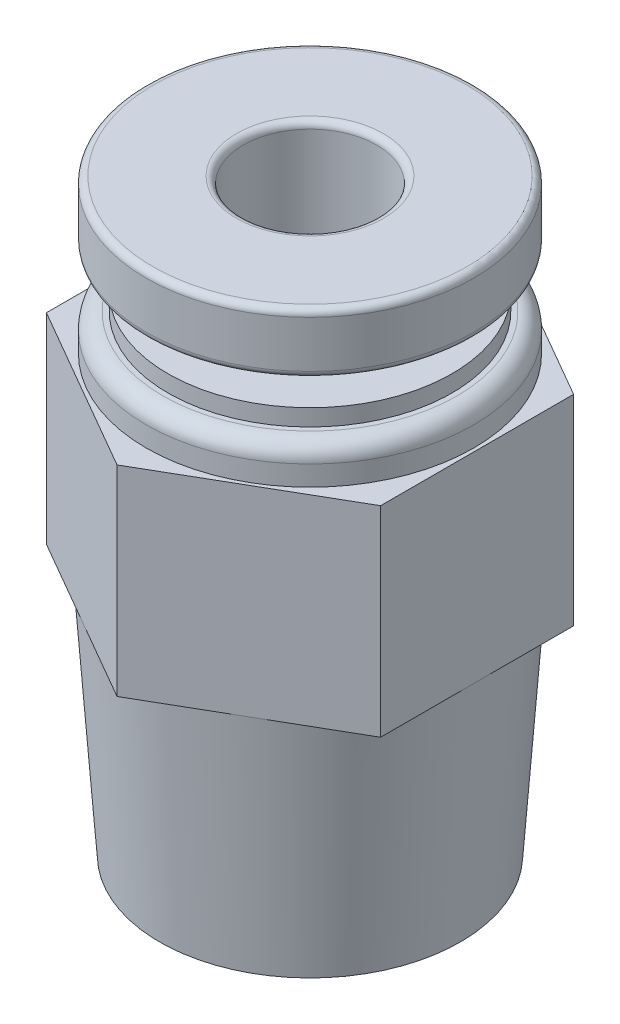
ISO-10303-21;
HEADER;
FILE_DESCRIPTION(('STEP AP214'),'2;1');
FILE_NAME('part.step','',(''),(''),'','','');
FILE_SCHEMA(('AUTOMOTIVE_DESIGN { 1 0 10303 214 1 1 1 1 }'));
ENDSEC;
DATA;
#1=APPLICATION_CONTEXT('core data for automotive mechanical design processes');
#2=APPLICATION_PROTOCOL_DEFINITION('international standard','automotive_design',2000,#1);
#3=PRODUCT_CONTEXT('',#1,'mechanical');
#4=PRODUCT('Part','Part','',(#3));
#5=PRODUCT_RELATED_PRODUCT_CATEGORY('part','',(#4));
#6=PRODUCT_DEFINITION_FORMATION('','',#4);
#7=PRODUCT_DEFINITION_CONTEXT('part definition',#1,'design');
#8=PRODUCT_DEFINITION('design','',#6,#7);
#9=PRODUCT_DEFINITION_SHAPE('','',#8);
#10=(LENGTH_UNIT() NAMED_UNIT(*) SI_UNIT(.MILLI.,.METRE.));
#11=(NAMED_UNIT(*) PLANE_ANGLE_UNIT() SI_UNIT($,.RADIAN.));
#12=(NAMED_UNIT(*) SI_UNIT($,.STERADIAN.) SOLID_ANGLE_UNIT());
#13=UNCERTAINTY_MEASURE_WITH_UNIT(LENGTH_MEASURE(1.E-05),#10,'distance_accuracy_value','');
#14=(GEOMETRIC_REPRESENTATION_CONTEXT(3) GLOBAL_UNCERTAINTY_ASSIGNED_CONTEXT((#13)) GLOBAL_UNIT_ASSIGNED_CONTEXT((#10,
#11,#12)) REPRESENTATION_CONTEXT('',''));
#15=CARTESIAN_POINT('',(0.,0.,0.));
#16=DIRECTION('',(0.,0.,1.));
#17=DIRECTION('',(1.,0.,0.));
#18=AXIS2_PLACEMENT_3D('',#15,#16,#17);
#19=CARTESIAN_POINT('',(0.,17.6,0.));
#20=DIRECTION('',(0.,-1.,0.));
#21=DIRECTION('',(0.,0.,-1.));
#22=AXIS2_PLACEMENT_3D('',#19,#20,#21);
#23=PLANE('',#22);
#24=CARTESIAN_POINT('',(0.,17.6,0.));
#25=DIRECTION('',(0.,-1.,0.));
#26=DIRECTION('',(0.,0.,-1.));
#27=AXIS2_PLACEMENT_3D('',#24,#25,#26);
#28=CIRCLE('',#27,2.2);
#29=CARTESIAN_POINT('',(0.,17.6,-2.2));
#30=VERTEX_POINT('',#29);
#31=EDGE_CURVE('E115',#30,#30,#28,.T.);
#32=ORIENTED_EDGE('',*,*,#31,.T.);
#33=EDGE_LOOP('',(#32));
#34=FACE_BOUND('',#33,.T.);
#35=CARTESIAN_POINT('',(0.,17.6,0.));
#36=DIRECTION('',(0.,-1.,0.));
#37=DIRECTION('',(0.,0.,-1.));
#38=AXIS2_PLACEMENT_3D('',#35,#36,#37);
#39=CIRCLE('',#38,4.7);
#40=CARTESIAN_POINT('',(0.,17.6,-4.7));
#41=VERTEX_POINT('',#40);
#42=EDGE_CURVE('E112',#41,#41,#39,.F.);
#43=ORIENTED_EDGE('',*,*,#42,.T.);
#44=EDGE_LOOP('',(#43));
#45=FACE_BOUND('',#44,.T.);
#46=ADVANCED_FACE('F17',(#34,#45),#23,.F.);
#47=CARTESIAN_POINT('',(0.,0.,0.));
#48=DIRECTION('',(0.,-1.,0.));
#49=DIRECTION('',(0.,0.,-1.));
#50=AXIS2_PLACEMENT_3D('',#47,#48,#49);
#51=PLANE('',#50);
#52=CARTESIAN_POINT('',(0.,0.,0.));
#53=DIRECTION('',(0.,1.,0.));
#54=DIRECTION('',(0.,0.,1.));
#55=AXIS2_PLACEMENT_3D('',#52,#53,#54);
#56=CIRCLE('',#55,2.);
#57=CARTESIAN_POINT('',(0.,0.,2.));
#58=VERTEX_POINT('',#57);
#59=EDGE_CURVE('E88',#58,#58,#56,.T.);
#60=ORIENTED_EDGE('',*,*,#59,.T.);
#61=EDGE_LOOP('',(#60));
#62=FACE_BOUND('',#61,.T.);
#63=CARTESIAN_POINT('',(0.,0.,0.));
#64=DIRECTION('',(0.,-1.,0.));
#65=DIRECTION('',(0.,0.,-1.));
#66=AXIS2_PLACEMENT_3D('',#63,#64,#65);
#67=CIRCLE('',#66,4.5);
#68=CARTESIAN_POINT('',(0.,0.,-4.5));
#69=VERTEX_POINT('',#68);
#70=EDGE_CURVE('E81',#69,#69,#67,.T.);
#71=ORIENTED_EDGE('',*,*,#70,.T.);
#72=EDGE_LOOP('',(#71));
#73=FACE_BOUND('',#72,.T.);
#74=ADVANCED_FACE('F137',(#62,#73),#51,.T.);
#75=CARTESIAN_POINT('',(-5.,17.6,-2.88675134594813));
#76=DIRECTION('',(0.5,0.,0.866025403784438));
#77=DIRECTION('',(0.866025403784438,0.,-0.5));
#78=AXIS2_PLACEMENT_3D('',#75,#76,#77);
#79=PLANE('',#78);
#80=DIRECTION('',(0.,-1.,0.));
#81=VECTOR('',#80,1.);
#82=CARTESIAN_POINT('',(-5.,17.6,-2.88675134594813));
#83=LINE('',#82,#81);
#84=CARTESIAN_POINT('',(-5.,13.,-2.88675134594813));
#85=VERTEX_POINT('',#84);
#86=CARTESIAN_POINT('',(-5.,7.,-2.88675134594813));
#87=VERTEX_POINT('',#86);
#88=EDGE_CURVE('E80',#85,#87,#83,.T.);
#89=ORIENTED_EDGE('',*,*,#88,.F.);
#90=DIRECTION('',(0.866025403784438,0.,-0.5));
#91=VECTOR('',#90,1.);
#92=CARTESIAN_POINT('',(-5.,13.,-2.88675134594813));
#93=LINE('',#92,#91);
#94=CARTESIAN_POINT('',(0.,13.,-5.77350269189627));
#95=VERTEX_POINT('',#94);
#96=EDGE_CURVE('E71',#85,#95,#93,.T.);
#97=ORIENTED_EDGE('',*,*,#96,.T.);
#98=DIRECTION('',(0.,-1.,0.));
#99=VECTOR('',#98,1.);
#100=CARTESIAN_POINT('',(0.,17.6,-5.77350269189627));
#101=LINE('',#100,#99);
#102=CARTESIAN_POINT('',(0.,7.,-5.77350269189627));
#103=VERTEX_POINT('',#102);
#104=EDGE_CURVE('E40',#95,#103,#101,.T.);
#105=ORIENTED_EDGE('',*,*,#104,.T.);
#106=DIRECTION('',(0.866025403784438,0.,-0.5));
#107=VECTOR('',#106,1.);
#108=CARTESIAN_POINT('',(-5.,7.,-2.88675134594813));
#109=LINE('',#108,#107);
#110=EDGE_CURVE('E93',#87,#103,#109,.T.);
#111=ORIENTED_EDGE('',*,*,#110,.F.);
#112=EDGE_LOOP('',(#89,#97,#105,#111));
#113=FACE_BOUND('',#112,.T.);
#114=ADVANCED_FACE('F79',(#113),#79,.F.);
#115=CARTESIAN_POINT('',(-5.,17.6,2.88675134594811));
#116=DIRECTION('',(1.,0.,0.));
#117=DIRECTION('',(0.,0.,-1.));
#118=AXIS2_PLACEMENT_3D('',#115,#116,#117);
#119=PLANE('',#118);
#120=DIRECTION('',(0.,-1.,0.));
#121=VECTOR('',#120,1.);
#122=CARTESIAN_POINT('',(-5.,17.6,2.88675134594811));
#123=LINE('',#122,#121);
#124=CARTESIAN_POINT('',(-5.,13.,2.88675134594811));
#125=VERTEX_POINT('',#124);
#126=CARTESIAN_POINT('',(-5.,7.,2.88675134594811));
#127=VERTEX_POINT('',#126);
#128=EDGE_CURVE('E100',#125,#127,#123,.T.);
#129=ORIENTED_EDGE('',*,*,#128,.F.);
#130=DIRECTION('',(0.,0.,-1.));
#131=VECTOR('',#130,1.);
#132=CARTESIAN_POINT('',(-5.,13.,2.88675134594811));
#133=LINE('',#132,#131);
#134=EDGE_CURVE('E82',#125,#85,#133,.T.);
#135=ORIENTED_EDGE('',*,*,#134,.T.);
#136=ORIENTED_EDGE('',*,*,#88,.T.);
#137=DIRECTION('',(0.,0.,-1.));
#138=VECTOR('',#137,1.);
#139=CARTESIAN_POINT('',(-5.,7.,2.88675134594811));
#140=LINE('',#139,#138);
#141=EDGE_CURVE('E236',#127,#87,#140,.T.);
#142=ORIENTED_EDGE('',*,*,#141,.F.);
#143=EDGE_LOOP('',(#129,#135,#136,#142));
#144=FACE_BOUND('',#143,.T.);
#145=ADVANCED_FACE('F165',(#144),#119,.F.);
#146=CARTESIAN_POINT('',(0.,17.6,5.77350269189627));
#147=DIRECTION('',(0.5,0.,-0.866025403784436));
#148=DIRECTION('',(-0.866025403784437,0.,-0.5));
#149=AXIS2_PLACEMENT_3D('',#146,#147,#148);
#150=PLANE('',#149);
#151=DIRECTION('',(0.,-1.,0.));
#152=VECTOR('',#151,1.);
#153=CARTESIAN_POINT('',(0.,17.6,5.77350269189627));
#154=LINE('',#153,#152);
#155=CARTESIAN_POINT('',(0.,13.,5.77350269189626));
#156=VERTEX_POINT('',#155);
#157=CARTESIAN_POINT('',(0.,7.,5.77350269189627));
#158=VERTEX_POINT('',#157);
#159=EDGE_CURVE('E98',#156,#158,#154,.T.);
#160=ORIENTED_EDGE('',*,*,#159,.F.);
#161=DIRECTION('',(-0.866025403784437,0.,-0.5));
#162=VECTOR('',#161,1.);
#163=CARTESIAN_POINT('',(0.,13.,5.77350269189627));
#164=LINE('',#163,#162);
#165=EDGE_CURVE('E244',#156,#125,#164,.T.);
#166=ORIENTED_EDGE('',*,*,#165,.T.);
#167=ORIENTED_EDGE('',*,*,#128,.T.);
#168=DIRECTION('',(-0.866025403784437,0.,-0.5));
#169=VECTOR('',#168,1.);
#170=CARTESIAN_POINT('',(0.,7.,5.77350269189627));
#171=LINE('',#170,#169);
#172=EDGE_CURVE('E233',#158,#127,#171,.T.);
#173=ORIENTED_EDGE('',*,*,#172,.F.);
#174=EDGE_LOOP('',(#160,#166,#167,#173));
#175=FACE_BOUND('',#174,.T.);
#176=ADVANCED_FACE('F161',(#175),#150,.F.);
#177=CARTESIAN_POINT('',(5.,17.6,2.88675134594813));
#178=DIRECTION('',(-0.5,0.,-0.866025403784438));
#179=DIRECTION('',(-0.866025403784438,0.,0.5));
#180=AXIS2_PLACEMENT_3D('',#177,#178,#179);
#181=PLANE('',#180);
#182=DIRECTION('',(0.,-1.,0.));
#183=VECTOR('',#182,1.);
#184=CARTESIAN_POINT('',(5.,17.6,2.88675134594813));
#185=LINE('',#184,#183);
#186=CARTESIAN_POINT('',(5.,13.,2.88675134594813));
#187=VERTEX_POINT('',#186);
#188=CARTESIAN_POINT('',(5.,7.,2.88675134594813));
#189=VERTEX_POINT('',#188);
#190=EDGE_CURVE('E90',#187,#189,#185,.T.);
#191=ORIENTED_EDGE('',*,*,#190,.F.);
#192=DIRECTION('',(-0.866025403784438,0.,0.5));
#193=VECTOR('',#192,1.);
#194=CARTESIAN_POINT('',(5.,13.,2.88675134594813));
#195=LINE('',#194,#193);
#196=EDGE_CURVE('E245',#187,#156,#195,.T.);
#197=ORIENTED_EDGE('',*,*,#196,.T.);
#198=ORIENTED_EDGE('',*,*,#159,.T.);
#199=DIRECTION('',(-0.866025403784438,0.,0.5));
#200=VECTOR('',#199,1.);
#201=CARTESIAN_POINT('',(5.,7.,2.88675134594813));
#202=LINE('',#201,#200);
#203=EDGE_CURVE('E230',#189,#158,#202,.T.);
#204=ORIENTED_EDGE('',*,*,#203,.F.);
#205=EDGE_LOOP('',(#191,#197,#198,#204));
#206=FACE_BOUND('',#205,.T.);
#207=ADVANCED_FACE('F157',(#206),#181,.F.);
#208=CARTESIAN_POINT('',(5.,17.6,-2.88675134594812));
#209=DIRECTION('',(-1.,0.,0.));
#210=DIRECTION('',(0.,0.,1.));
#211=AXIS2_PLACEMENT_3D('',#208,#209,#210);
#212=PLANE('',#211);
#213=DIRECTION('',(0.,-1.,0.));
#214=VECTOR('',#213,1.);
#215=CARTESIAN_POINT('',(5.,17.6,-2.88675134594812));
#216=LINE('',#215,#214);
#217=CARTESIAN_POINT('',(5.,13.,-2.88675134594812));
#218=VERTEX_POINT('',#217);
#219=CARTESIAN_POINT('',(5.,7.,-2.88675134594812));
#220=VERTEX_POINT('',#219);
#221=EDGE_CURVE('E87',#218,#220,#216,.T.);
#222=ORIENTED_EDGE('',*,*,#221,.F.);
#223=DIRECTION('',(0.,0.,1.));
#224=VECTOR('',#223,1.);
#225=CARTESIAN_POINT('',(5.,13.,-2.88675134594812));
#226=LINE('',#225,#224);
#227=EDGE_CURVE('E32',#218,#187,#226,.T.);
#228=ORIENTED_EDGE('',*,*,#227,.T.);
#229=ORIENTED_EDGE('',*,*,#190,.T.);
#230=DIRECTION('',(0.,0.,1.));
#231=VECTOR('',#230,1.);
#232=CARTESIAN_POINT('',(5.,7.,-2.88675134594812));
#233=LINE('',#232,#231);
#234=EDGE_CURVE('E224',#220,#189,#233,.T.);
#235=ORIENTED_EDGE('',*,*,#234,.F.);
#236=EDGE_LOOP('',(#222,#228,#229,#235));
#237=FACE_BOUND('',#236,.T.);
#238=ADVANCED_FACE('F154',(#237),#212,.F.);
#239=CARTESIAN_POINT('',(0.,17.6,-5.77350269189627));
#240=DIRECTION('',(-0.5,0.,0.866025403784437));
#241=DIRECTION('',(0.866025403784437,0.,0.5));
#242=AXIS2_PLACEMENT_3D('',#239,#240,#241);
#243=PLANE('',#242);
#244=ORIENTED_EDGE('',*,*,#104,.F.);
#245=DIRECTION('',(0.866025403784437,0.,0.5));
#246=VECTOR('',#245,1.);
#247=CARTESIAN_POINT('',(0.,13.,-5.77350269189627));
#248=LINE('',#247,#246);
#249=EDGE_CURVE('E69',#95,#218,#248,.T.);
#250=ORIENTED_EDGE('',*,*,#249,.T.);
#251=ORIENTED_EDGE('',*,*,#221,.T.);
#252=DIRECTION('',(0.866025403784437,0.,0.5));
#253=VECTOR('',#252,1.);
#254=CARTESIAN_POINT('',(0.,7.,-5.77350269189627));
#255=LINE('',#254,#253);
#256=EDGE_CURVE('E76',#103,#220,#255,.T.);
#257=ORIENTED_EDGE('',*,*,#256,.F.);
#258=EDGE_LOOP('',(#244,#250,#251,#257));
#259=FACE_BOUND('',#258,.T.);
#260=ADVANCED_FACE('F85',(#259),#243,.F.);
#261=CARTESIAN_POINT('',(0.,17.6,0.));
#262=DIRECTION('',(0.,-1.,0.));
#263=DIRECTION('',(0.,0.,-1.));
#264=AXIS2_PLACEMENT_3D('',#261,#262,#263);
#265=CYLINDRICAL_SURFACE('',#264,2.);
#266=CARTESIAN_POINT('',(0.,17.4,0.));
#267=DIRECTION('',(0.,-1.,0.));
#268=DIRECTION('',(0.,0.,-1.));
#269=AXIS2_PLACEMENT_3D('',#266,#267,#268);
#270=CIRCLE('',#269,2.);
#271=CARTESIAN_POINT('',(0.,17.4,-2.));
#272=VERTEX_POINT('',#271);
#273=EDGE_CURVE('E109',#272,#272,#270,.F.);
#274=ORIENTED_EDGE('',*,*,#273,.T.);
#275=EDGE_LOOP('',(#274));
#276=FACE_BOUND('',#275,.T.);
#277=ORIENTED_EDGE('',*,*,#59,.F.);
#278=EDGE_LOOP('',(#277));
#279=FACE_BOUND('',#278,.T.);
#280=ADVANCED_FACE('F149',(#276,#279),#265,.F.);
#281=CARTESIAN_POINT('',(0.,7.,0.));
#282=DIRECTION('',(0.,-1.,0.));
#283=DIRECTION('',(0.,0.,-1.));
#284=AXIS2_PLACEMENT_3D('',#281,#282,#283);
#285=PLANE('',#284);
#286=CARTESIAN_POINT('',(0.,7.,0.));
#287=DIRECTION('',(0.,-1.,0.));
#288=DIRECTION('',(0.,0.,-1.));
#289=AXIS2_PLACEMENT_3D('',#286,#287,#288);
#290=CIRCLE('',#289,4.98948768360457);
#291=CARTESIAN_POINT('',(0.,7.,-4.98948768360457));
#292=VERTEX_POINT('',#291);
#293=EDGE_CURVE('E219',#292,#292,#290,.T.);
#294=ORIENTED_EDGE('',*,*,#293,.F.);
#295=EDGE_LOOP('',(#294));
#296=FACE_BOUND('',#295,.T.);
#297=ORIENTED_EDGE('',*,*,#110,.T.);
#298=ORIENTED_EDGE('',*,*,#256,.T.);
#299=ORIENTED_EDGE('',*,*,#234,.T.);
#300=ORIENTED_EDGE('',*,*,#203,.T.);
#301=ORIENTED_EDGE('',*,*,#172,.T.);
#302=ORIENTED_EDGE('',*,*,#141,.T.);
#303=EDGE_LOOP('',(#297,#298,#299,#300,#301,#302));
#304=FACE_BOUND('',#303,.T.);
#305=ADVANCED_FACE('F207',(#296,#304),#285,.T.);
#306=CARTESIAN_POINT('',(0.,0.,0.));
#307=DIRECTION('',(0.,1.,0.));
#308=DIRECTION('',(0.,0.,-1.));
#309=AXIS2_PLACEMENT_3D('',#306,#307,#308);
#310=CONICAL_SURFACE('',#309,4.5,0.0698131700797734);
#311=ORIENTED_EDGE('',*,*,#293,.T.);
#312=EDGE_LOOP('',(#311));
#313=FACE_BOUND('',#312,.T.);
#314=ORIENTED_EDGE('',*,*,#70,.F.);
#315=EDGE_LOOP('',(#314));
#316=FACE_BOUND('',#315,.T.);
#317=ADVANCED_FACE('F202',(#313,#316),#310,.T.);
#318=CARTESIAN_POINT('',(-4.9,13.,0.));
#319=DIRECTION('',(0.,-1.,0.));
#320=DIRECTION('',(1.,0.,0.));
#321=AXIS2_PLACEMENT_3D('',#318,#319,#320);
#322=PLANE('',#321);
#323=CARTESIAN_POINT('',(0.,13.,0.));
#324=DIRECTION('',(0.,1.,0.));
#325=DIRECTION('',(-1.,0.,0.));
#326=AXIS2_PLACEMENT_3D('',#323,#324,#325);
#327=CIRCLE('',#326,4.9);
#328=CARTESIAN_POINT('',(-4.9,13.,0.));
#329=VERTEX_POINT('',#328);
#330=EDGE_CURVE('E260',#329,#329,#327,.T.);
#331=ORIENTED_EDGE('',*,*,#330,.F.);
#332=EDGE_LOOP('',(#331));
#333=FACE_BOUND('',#332,.T.);
#334=ORIENTED_EDGE('',*,*,#134,.F.);
#335=ORIENTED_EDGE('',*,*,#165,.F.);
#336=ORIENTED_EDGE('',*,*,#196,.F.);
#337=ORIENTED_EDGE('',*,*,#227,.F.);
#338=ORIENTED_EDGE('',*,*,#249,.F.);
#339=ORIENTED_EDGE('',*,*,#96,.F.);
#340=EDGE_LOOP('',(#334,#335,#336,#337,#338,#339));
#341=FACE_BOUND('',#340,.T.);
#342=ADVANCED_FACE('F70',(#333,#341),#322,.F.);
#343=CARTESIAN_POINT('',(0.,22.2170384822299,0.));
#344=DIRECTION('',(0.,1.,0.));
#345=DIRECTION('',(-1.,0.,0.));
#346=AXIS2_PLACEMENT_3D('',#343,#344,#345);
#347=CYLINDRICAL_SURFACE('',#346,4.9);
#348=CARTESIAN_POINT('',(0.,16.,0.));
#349=DIRECTION('',(0.,1.,0.));
#350=DIRECTION('',(-1.,0.,0.));
#351=AXIS2_PLACEMENT_3D('',#348,#349,#350);
#352=CIRCLE('',#351,4.9);
#353=CARTESIAN_POINT('',(-4.9,16.,0.));
#354=VERTEX_POINT('',#353);
#355=EDGE_CURVE('E11',#354,#354,#352,.T.);
#356=ORIENTED_EDGE('',*,*,#355,.T.);
#357=EDGE_LOOP('',(#356));
#358=FACE_BOUND('',#357,.T.);
#359=CARTESIAN_POINT('',(0.,17.4,0.));
#360=DIRECTION('',(0.,-1.,0.));
#361=DIRECTION('',(0.,0.,-1.));
#362=AXIS2_PLACEMENT_3D('',#359,#360,#361);
#363=CIRCLE('',#362,4.9);
#364=CARTESIAN_POINT('',(0.,17.4,-4.9));
#365=VERTEX_POINT('',#364);
#366=EDGE_CURVE('E25',#365,#365,#363,.T.);
#367=ORIENTED_EDGE('',*,*,#366,.T.);
#368=EDGE_LOOP('',(#367));
#369=FACE_BOUND('',#368,.T.);
#370=ADVANCED_FACE('F129',(#358,#369),#347,.T.);
#371=CARTESIAN_POINT('',(-4.9,15.8,0.));
#372=DIRECTION('',(0.,1.,0.));
#373=DIRECTION('',(-1.,0.,0.));
#374=AXIS2_PLACEMENT_3D('',#371,#372,#373);
#375=PLANE('',#374);
#376=CARTESIAN_POINT('',(0.,15.8,0.));
#377=DIRECTION('',(0.,1.,0.));
#378=DIRECTION('',(-1.,0.,0.));
#379=AXIS2_PLACEMENT_3D('',#376,#377,#378);
#380=CIRCLE('',#379,2.95);
#381=CARTESIAN_POINT('',(-2.95,15.8,0.));
#382=VERTEX_POINT('',#381);
#383=EDGE_CURVE('E121',#382,#382,#380,.T.);
#384=ORIENTED_EDGE('',*,*,#383,.T.);
#385=EDGE_LOOP('',(#384));
#386=FACE_BOUND('',#385,.T.);
#387=CARTESIAN_POINT('',(0.,15.8,0.));
#388=DIRECTION('',(0.,1.,0.));
#389=DIRECTION('',(-1.,0.,0.));
#390=AXIS2_PLACEMENT_3D('',#387,#388,#389);
#391=CIRCLE('',#390,4.7);
#392=CARTESIAN_POINT('',(-4.7,15.8,0.));
#393=VERTEX_POINT('',#392);
#394=EDGE_CURVE('E118',#393,#393,#391,.F.);
#395=ORIENTED_EDGE('',*,*,#394,.T.);
#396=EDGE_LOOP('',(#395));
#397=FACE_BOUND('',#396,.T.);
#398=ADVANCED_FACE('F193',(#386,#397),#375,.F.);
#399=CARTESIAN_POINT('',(0.,22.2170384822299,0.));
#400=DIRECTION('',(0.,1.,0.));
#401=DIRECTION('',(-1.,0.,0.));
#402=AXIS2_PLACEMENT_3D('',#399,#400,#401);
#403=CYLINDRICAL_SURFACE('',#402,2.75);
#404=CARTESIAN_POINT('',(0.,15.6,0.));
#405=DIRECTION('',(0.,1.,0.));
#406=DIRECTION('',(-1.,0.,0.));
#407=AXIS2_PLACEMENT_3D('',#404,#405,#406);
#408=CIRCLE('',#407,2.75);
#409=CARTESIAN_POINT('',(-2.75,15.6,0.));
#410=VERTEX_POINT('',#409);
#411=EDGE_CURVE('E124',#410,#410,#408,.F.);
#412=ORIENTED_EDGE('',*,*,#411,.T.);
#413=EDGE_LOOP('',(#412));
#414=FACE_BOUND('',#413,.T.);
#415=CARTESIAN_POINT('',(0.,14.6,0.));
#416=DIRECTION('',(0.,1.,0.));
#417=DIRECTION('',(-1.,0.,0.));
#418=AXIS2_PLACEMENT_3D('',#415,#416,#417);
#419=CIRCLE('',#418,2.75);
#420=CARTESIAN_POINT('',(-2.75,14.6,0.));
#421=VERTEX_POINT('',#420);
#422=EDGE_CURVE('E251',#421,#421,#419,.T.);
#423=ORIENTED_EDGE('',*,*,#422,.T.);
#424=EDGE_LOOP('',(#423));
#425=FACE_BOUND('',#424,.T.);
#426=ADVANCED_FACE('F198',(#414,#425),#403,.T.);
#427=CARTESIAN_POINT('',(-2.75,14.6,0.));
#428=DIRECTION('',(0.,-1.,0.));
#429=DIRECTION('',(1.,0.,0.));
#430=AXIS2_PLACEMENT_3D('',#427,#428,#429);
#431=PLANE('',#430);
#432=ORIENTED_EDGE('',*,*,#422,.F.);
#433=EDGE_LOOP('',(#432));
#434=FACE_BOUND('',#433,.T.);
#435=CARTESIAN_POINT('',(0.,14.6,0.));
#436=DIRECTION('',(0.,1.,0.));
#437=DIRECTION('',(-1.,0.,0.));
#438=AXIS2_PLACEMENT_3D('',#435,#436,#437);
#439=CIRCLE('',#438,4.25);
#440=CARTESIAN_POINT('',(-4.25,14.6,0.));
#441=VERTEX_POINT('',#440);
#442=EDGE_CURVE('E254',#441,#441,#439,.T.);
#443=ORIENTED_EDGE('',*,*,#442,.T.);
#444=EDGE_LOOP('',(#443));
#445=FACE_BOUND('',#444,.T.);
#446=ADVANCED_FACE('F278',(#434,#445),#431,.F.);
#447=CARTESIAN_POINT('',(0.,22.2170384822299,0.));
#448=DIRECTION('',(0.,1.,0.));
#449=DIRECTION('',(-1.,0.,0.));
#450=AXIS2_PLACEMENT_3D('',#447,#448,#449);
#451=CYLINDRICAL_SURFACE('',#450,4.25);
#452=ORIENTED_EDGE('',*,*,#442,.F.);
#453=EDGE_LOOP('',(#452));
#454=FACE_BOUND('',#453,.T.);
#455=CARTESIAN_POINT('',(0.,14.1,0.));
#456=DIRECTION('',(0.,1.,0.));
#457=DIRECTION('',(-1.,0.,0.));
#458=AXIS2_PLACEMENT_3D('',#455,#456,#457);
#459=CIRCLE('',#458,4.25);
#460=CARTESIAN_POINT('',(-4.25,14.1,0.));
#461=VERTEX_POINT('',#460);
#462=EDGE_CURVE('E257',#461,#461,#459,.T.);
#463=ORIENTED_EDGE('',*,*,#462,.T.);
#464=EDGE_LOOP('',(#463));
#465=FACE_BOUND('',#464,.T.);
#466=ADVANCED_FACE('F272',(#454,#465),#451,.T.);
#467=CARTESIAN_POINT('',(-4.25,14.1,0.));
#468=DIRECTION('',(0.,-1.,0.));
#469=DIRECTION('',(1.,0.,0.));
#470=AXIS2_PLACEMENT_3D('',#467,#468,#469);
#471=PLANE('',#470);
#472=CARTESIAN_POINT('',(0.,14.1,0.));
#473=DIRECTION('',(0.,-1.,0.));
#474=DIRECTION('',(1.,0.,0.));
#475=AXIS2_PLACEMENT_3D('',#472,#473,#474);
#476=CIRCLE('',#475,4.4);
#477=CARTESIAN_POINT('',(4.4,14.1,0.));
#478=VERTEX_POINT('',#477);
#479=EDGE_CURVE('E75',#478,#478,#476,.F.);
#480=ORIENTED_EDGE('',*,*,#479,.T.);
#481=EDGE_LOOP('',(#480));
#482=FACE_BOUND('',#481,.T.);
#483=ORIENTED_EDGE('',*,*,#462,.F.);
#484=EDGE_LOOP('',(#483));
#485=FACE_BOUND('',#484,.T.);
#486=ADVANCED_FACE('F265',(#482,#485),#471,.F.);
#487=CARTESIAN_POINT('',(0.,22.2170384822299,0.));
#488=DIRECTION('',(0.,1.,0.));
#489=DIRECTION('',(-1.,0.,0.));
#490=AXIS2_PLACEMENT_3D('',#487,#488,#489);
#491=CYLINDRICAL_SURFACE('',#490,4.9);
#492=CARTESIAN_POINT('',(0.,13.6,0.));
#493=DIRECTION('',(0.,-1.,0.));
#494=DIRECTION('',(1.,0.,0.));
#495=AXIS2_PLACEMENT_3D('',#492,#493,#494);
#496=CIRCLE('',#495,4.9);
#497=CARTESIAN_POINT('',(4.9,13.6,0.));
#498=VERTEX_POINT('',#497);
#499=EDGE_CURVE('E106',#498,#498,#496,.T.);
#500=ORIENTED_EDGE('',*,*,#499,.T.);
#501=EDGE_LOOP('',(#500));
#502=FACE_BOUND('',#501,.T.);
#503=ORIENTED_EDGE('',*,*,#330,.T.);
#504=EDGE_LOOP('',(#503));
#505=FACE_BOUND('',#504,.T.);
#506=ADVANCED_FACE('F176',(#502,#505),#491,.T.);
#507=CARTESIAN_POINT('',(0.,13.6,0.));
#508=DIRECTION('',(0.,-1.,0.));
#509=DIRECTION('',(1.,0.,0.));
#510=AXIS2_PLACEMENT_3D('',#507,#508,#509);
#511=TOROIDAL_SURFACE('',#510,4.4,0.5);
#512=ORIENTED_EDGE('',*,*,#499,.F.);
#513=EDGE_LOOP('',(#512));
#514=FACE_BOUND('',#513,.T.);
#515=ORIENTED_EDGE('',*,*,#479,.F.);
#516=EDGE_LOOP('',(#515));
#517=FACE_BOUND('',#516,.T.);
#518=ADVANCED_FACE('F172',(#514,#517),#511,.T.);
#519=CARTESIAN_POINT('',(0.,17.4,0.));
#520=DIRECTION('',(0.,-1.,0.));
#521=DIRECTION('',(0.,0.,-1.));
#522=AXIS2_PLACEMENT_3D('',#519,#520,#521);
#523=TOROIDAL_SURFACE('',#522,2.2,0.2);
#524=ORIENTED_EDGE('',*,*,#31,.F.);
#525=EDGE_LOOP('',(#524));
#526=FACE_BOUND('',#525,.T.);
#527=ORIENTED_EDGE('',*,*,#273,.F.);
#528=EDGE_LOOP('',(#527));
#529=FACE_BOUND('',#528,.T.);
#530=ADVANCED_FACE('F175',(#526,#529),#523,.T.);
#531=CARTESIAN_POINT('',(0.,15.6,0.));
#532=DIRECTION('',(0.,1.,0.));
#533=DIRECTION('',(-1.,0.,0.));
#534=AXIS2_PLACEMENT_3D('',#531,#532,#533);
#535=TOROIDAL_SURFACE('',#534,2.95,0.2);
#536=ORIENTED_EDGE('',*,*,#411,.F.);
#537=EDGE_LOOP('',(#536));
#538=FACE_BOUND('',#537,.T.);
#539=ORIENTED_EDGE('',*,*,#383,.F.);
#540=EDGE_LOOP('',(#539));
#541=FACE_BOUND('',#540,.T.);
#542=ADVANCED_FACE('F180',(#538,#541),#535,.F.);
#543=CARTESIAN_POINT('',(0.,16.,0.));
#544=DIRECTION('',(0.,1.,0.));
#545=DIRECTION('',(-1.,0.,0.));
#546=AXIS2_PLACEMENT_3D('',#543,#544,#545);
#547=TOROIDAL_SURFACE('',#546,4.7,0.2);
#548=ORIENTED_EDGE('',*,*,#394,.F.);
#549=EDGE_LOOP('',(#548));
#550=FACE_BOUND('',#549,.T.);
#551=ORIENTED_EDGE('',*,*,#355,.F.);
#552=EDGE_LOOP('',(#551));
#553=FACE_BOUND('',#552,.T.);
#554=ADVANCED_FACE('F133',(#550,#553),#547,.T.);
#555=CARTESIAN_POINT('',(0.,17.4,0.));
#556=DIRECTION('',(0.,-1.,0.));
#557=DIRECTION('',(0.,0.,-1.));
#558=AXIS2_PLACEMENT_3D('',#555,#556,#557);
#559=TOROIDAL_SURFACE('',#558,4.7,0.2);
#560=ORIENTED_EDGE('',*,*,#366,.F.);
#561=EDGE_LOOP('',(#560));
#562=FACE_BOUND('',#561,.T.);
#563=ORIENTED_EDGE('',*,*,#42,.F.);
#564=EDGE_LOOP('',(#563));
#565=FACE_BOUND('',#564,.T.);
#566=ADVANCED_FACE('F19',(#562,#565),#559,.T.);
#567=CLOSED_SHELL('',(#46,#74,#114,#145,#176,#207,#238,#260,#280,#305,#317,#342,#370,#398,#426,
#446,#466,#486,#506,#518,#530,#542,#554,#566));
#568=MANIFOLD_SOLID_BREP('B1',#567);
#569=ADVANCED_BREP_SHAPE_REPRESENTATION('',(#18,#568),#14);
#570=SHAPE_DEFINITION_REPRESENTATION(#9,#569);
ENDSEC;
END-ISO-10303-21;
